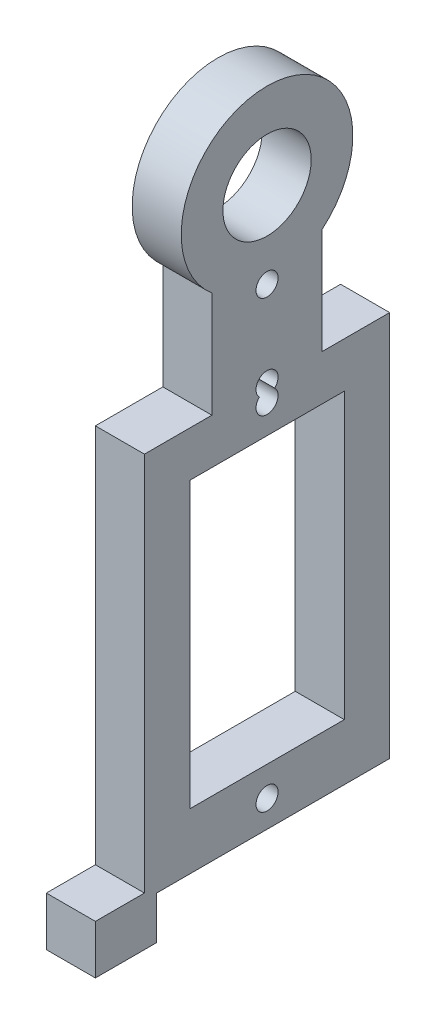
ISO-10303-21;
HEADER;
FILE_DESCRIPTION(('STEP AP214'),'2;1');
FILE_NAME('part.step','',(''),(''),'','','');
FILE_SCHEMA(('AUTOMOTIVE_DESIGN { 1 0 10303 214 1 1 1 1 }'));
ENDSEC;
DATA;
#1=APPLICATION_CONTEXT('core data for automotive mechanical design processes');
#2=APPLICATION_PROTOCOL_DEFINITION('international standard','automotive_design',2000,#1);
#3=PRODUCT_CONTEXT('',#1,'mechanical');
#4=PRODUCT('Part','Part','',(#3));
#5=PRODUCT_RELATED_PRODUCT_CATEGORY('part','',(#4));
#6=PRODUCT_DEFINITION_FORMATION('','',#4);
#7=PRODUCT_DEFINITION_CONTEXT('part definition',#1,'design');
#8=PRODUCT_DEFINITION('design','',#6,#7);
#9=PRODUCT_DEFINITION_SHAPE('','',#8);
#10=(LENGTH_UNIT() NAMED_UNIT(*) SI_UNIT(.MILLI.,.METRE.));
#11=(NAMED_UNIT(*) PLANE_ANGLE_UNIT() SI_UNIT($,.RADIAN.));
#12=(NAMED_UNIT(*) SI_UNIT($,.STERADIAN.) SOLID_ANGLE_UNIT());
#13=UNCERTAINTY_MEASURE_WITH_UNIT(LENGTH_MEASURE(1.E-05),#10,'distance_accuracy_value','');
#14=(GEOMETRIC_REPRESENTATION_CONTEXT(3) GLOBAL_UNCERTAINTY_ASSIGNED_CONTEXT((#13)) GLOBAL_UNIT_ASSIGNED_CONTEXT((#10,
#11,#12)) REPRESENTATION_CONTEXT('',''));
#15=CARTESIAN_POINT('',(0.,0.,0.));
#16=DIRECTION('',(0.,0.,1.));
#17=DIRECTION('',(1.,0.,0.));
#18=AXIS2_PLACEMENT_3D('',#15,#16,#17);
#19=CARTESIAN_POINT('',(5.,-14.,0.));
#20=DIRECTION('',(-1.,0.,0.));
#21=DIRECTION('',(0.,0.,1.));
#22=AXIS2_PLACEMENT_3D('',#19,#20,#21);
#23=CYLINDRICAL_SURFACE('',#22,0.9);
#24=CARTESIAN_POINT('',(4.,-14.,0.));
#25=DIRECTION('',(1.,0.,0.));
#26=DIRECTION('',(0.,0.,-1.));
#27=AXIS2_PLACEMENT_3D('',#24,#25,#26);
#28=CIRCLE('',#27,0.9);
#29=CARTESIAN_POINT('',(4.,-14.65,0.622494979899437));
#30=VERTEX_POINT('',#29);
#31=CARTESIAN_POINT('',(4.,-14.65,-0.622494979899437));
#32=VERTEX_POINT('',#31);
#33=EDGE_CURVE('E179',#30,#32,#28,.F.);
#34=ORIENTED_EDGE('',*,*,#33,.F.);
#35=DIRECTION('',(-1.,0.,0.));
#36=VECTOR('',#35,1.);
#37=CARTESIAN_POINT('',(2.,-14.65,0.622494979899437));
#38=LINE('',#37,#36);
#39=CARTESIAN_POINT('',(0.,-14.65,0.622494979899437));
#40=VERTEX_POINT('',#39);
#41=EDGE_CURVE('E11',#30,#40,#38,.T.);
#42=ORIENTED_EDGE('',*,*,#41,.T.);
#43=CARTESIAN_POINT('',(0.,-14.,0.));
#44=DIRECTION('',(1.,0.,0.));
#45=DIRECTION('',(0.,0.,-1.));
#46=AXIS2_PLACEMENT_3D('',#43,#44,#45);
#47=CIRCLE('',#46,0.9);
#48=CARTESIAN_POINT('',(0.,-14.65,-0.622494979899438));
#49=VERTEX_POINT('',#48);
#50=EDGE_CURVE('E177',#40,#49,#47,.F.);
#51=ORIENTED_EDGE('',*,*,#50,.T.);
#52=DIRECTION('',(-1.,0.,0.));
#53=VECTOR('',#52,1.);
#54=CARTESIAN_POINT('',(2.,-14.65,-0.622494979899437));
#55=LINE('',#54,#53);
#56=EDGE_CURVE('E51',#49,#32,#55,.F.);
#57=ORIENTED_EDGE('',*,*,#56,.T.);
#58=EDGE_LOOP('',(#34,#42,#51,#57));
#59=FACE_BOUND('',#58,.T.);
#60=ADVANCED_FACE('F43',(#59),#23,.F.);
#61=CARTESIAN_POINT('',(4.,0.,0.));
#62=DIRECTION('',(1.,0.,0.));
#63=DIRECTION('',(0.,0.,-1.));
#64=AXIS2_PLACEMENT_3D('',#61,#62,#63);
#65=PLANE('',#64);
#66=CARTESIAN_POINT('',(4.,-43.3,0.));
#67=DIRECTION('',(1.,0.,0.));
#68=DIRECTION('',(0.,0.,-1.));
#69=AXIS2_PLACEMENT_3D('',#66,#67,#68);
#70=CIRCLE('',#69,0.9);
#71=CARTESIAN_POINT('',(4.,-43.3,-0.9));
#72=VERTEX_POINT('',#71);
#73=EDGE_CURVE('E202',#72,#72,#70,.F.);
#74=ORIENTED_EDGE('',*,*,#73,.T.);
#75=EDGE_LOOP('',(#74));
#76=FACE_BOUND('',#75,.T.);
#77=ORIENTED_EDGE('',*,*,#33,.T.);
#78=CARTESIAN_POINT('',(4.,-15.3,0.));
#79=DIRECTION('',(1.,0.,0.));
#80=DIRECTION('',(0.,0.,-1.));
#81=AXIS2_PLACEMENT_3D('',#78,#79,#80);
#82=CIRCLE('',#81,0.9);
#83=EDGE_CURVE('E58',#32,#30,#82,.F.);
#84=ORIENTED_EDGE('',*,*,#83,.T.);
#85=EDGE_LOOP('',(#77,#84));
#86=FACE_BOUND('',#85,.T.);
#87=CARTESIAN_POINT('',(4.,-7.,0.));
#88=DIRECTION('',(1.,0.,0.));
#89=DIRECTION('',(0.,0.,-1.));
#90=AXIS2_PLACEMENT_3D('',#87,#88,#89);
#91=CIRCLE('',#90,0.9);
#92=CARTESIAN_POINT('',(4.,-7.,-0.9));
#93=VERTEX_POINT('',#92);
#94=EDGE_CURVE('E226',#93,#93,#91,.F.);
#95=ORIENTED_EDGE('',*,*,#94,.T.);
#96=EDGE_LOOP('',(#95));
#97=FACE_BOUND('',#96,.T.);
#98=CARTESIAN_POINT('',(4.,0.,0.));
#99=DIRECTION('',(1.,0.,0.));
#100=DIRECTION('',(0.,0.,-1.));
#101=AXIS2_PLACEMENT_3D('',#98,#99,#100);
#102=CIRCLE('',#101,3.6);
#103=CARTESIAN_POINT('',(4.,0.,-3.6));
#104=VERTEX_POINT('',#103);
#105=EDGE_CURVE('E230',#104,#104,#102,.F.);
#106=ORIENTED_EDGE('',*,*,#105,.T.);
#107=EDGE_LOOP('',(#106));
#108=FACE_BOUND('',#107,.T.);
#109=DIRECTION('',(0.,1.,0.));
#110=VECTOR('',#109,1.);
#111=CARTESIAN_POINT('',(4.,-49.,9.));
#112=LINE('',#111,#110);
#113=CARTESIAN_POINT('',(4.,-49.,9.));
#114=VERTEX_POINT('',#113);
#115=CARTESIAN_POINT('',(4.,-45.5,9.));
#116=VERTEX_POINT('',#115);
#117=EDGE_CURVE('E238',#114,#116,#112,.T.);
#118=ORIENTED_EDGE('',*,*,#117,.T.);
#119=DIRECTION('',(0.,0.,-1.));
#120=VECTOR('',#119,1.);
#121=CARTESIAN_POINT('',(4.,-45.5,10.));
#122=LINE('',#121,#120);
#123=CARTESIAN_POINT('',(4.,-45.5,-10.));
#124=VERTEX_POINT('',#123);
#125=EDGE_CURVE('E286',#116,#124,#122,.T.);
#126=ORIENTED_EDGE('',*,*,#125,.T.);
#127=DIRECTION('',(0.,1.,0.));
#128=VECTOR('',#127,1.);
#129=CARTESIAN_POINT('',(4.,-45.5,-10.));
#130=LINE('',#129,#128);
#131=CARTESIAN_POINT('',(4.,-14.,-10.));
#132=VERTEX_POINT('',#131);
#133=EDGE_CURVE('E275',#124,#132,#130,.T.);
#134=ORIENTED_EDGE('',*,*,#133,.T.);
#135=DIRECTION('',(0.,0.,-1.));
#136=VECTOR('',#135,1.);
#137=CARTESIAN_POINT('',(4.,-14.,10.));
#138=LINE('',#137,#136);
#139=CARTESIAN_POINT('',(4.,-14.,-4.5));
#140=VERTEX_POINT('',#139);
#141=EDGE_CURVE('E283',#140,#132,#138,.T.);
#142=ORIENTED_EDGE('',*,*,#141,.F.);
#143=DIRECTION('',(0.,1.,0.));
#144=VECTOR('',#143,1.);
#145=CARTESIAN_POINT('',(4.,-34.,-4.5));
#146=LINE('',#145,#144);
#147=CARTESIAN_POINT('',(4.,-5.3619026473818,-4.5));
#148=VERTEX_POINT('',#147);
#149=EDGE_CURVE('E297',#140,#148,#146,.T.);
#150=ORIENTED_EDGE('',*,*,#149,.T.);
#151=CARTESIAN_POINT('',(4.,0.,0.));
#152=DIRECTION('',(1.,0.,0.));
#153=DIRECTION('',(0.,0.,-1.));
#154=AXIS2_PLACEMENT_3D('',#151,#152,#153);
#155=CIRCLE('',#154,7.);
#156=CARTESIAN_POINT('',(4.,-5.3619026473818,4.5));
#157=VERTEX_POINT('',#156);
#158=EDGE_CURVE('E308',#148,#157,#155,.T.);
#159=ORIENTED_EDGE('',*,*,#158,.T.);
#160=DIRECTION('',(0.,1.,0.));
#161=VECTOR('',#160,1.);
#162=CARTESIAN_POINT('',(4.,-34.,4.5));
#163=LINE('',#162,#161);
#164=CARTESIAN_POINT('',(4.,-14.,4.5));
#165=VERTEX_POINT('',#164);
#166=EDGE_CURVE('E296',#165,#157,#163,.T.);
#167=ORIENTED_EDGE('',*,*,#166,.F.);
#168=CARTESIAN_POINT('',(4.,-14.,10.));
#169=VERTEX_POINT('',#168);
#170=EDGE_CURVE('E284',#169,#165,#138,.T.);
#171=ORIENTED_EDGE('',*,*,#170,.F.);
#172=DIRECTION('',(0.,1.,0.));
#173=VECTOR('',#172,1.);
#174=CARTESIAN_POINT('',(4.,-45.5,10.));
#175=LINE('',#174,#173);
#176=CARTESIAN_POINT('',(4.,-45.,10.));
#177=VERTEX_POINT('',#176);
#178=EDGE_CURVE('E264',#177,#169,#175,.T.);
#179=ORIENTED_EDGE('',*,*,#178,.F.);
#180=DIRECTION('',(0.,0.,-1.));
#181=VECTOR('',#180,1.);
#182=CARTESIAN_POINT('',(4.,-45.,14.));
#183=LINE('',#182,#181);
#184=CARTESIAN_POINT('',(4.,-45.,14.));
#185=VERTEX_POINT('',#184);
#186=EDGE_CURVE('E252',#185,#177,#183,.T.);
#187=ORIENTED_EDGE('',*,*,#186,.F.);
#188=DIRECTION('',(0.,1.,0.));
#189=VECTOR('',#188,1.);
#190=CARTESIAN_POINT('',(4.,-49.,14.));
#191=LINE('',#190,#189);
#192=CARTESIAN_POINT('',(4.,-49.,14.));
#193=VERTEX_POINT('',#192);
#194=EDGE_CURVE('E240',#193,#185,#191,.T.);
#195=ORIENTED_EDGE('',*,*,#194,.F.);
#196=DIRECTION('',(0.,0.,-1.));
#197=VECTOR('',#196,1.);
#198=CARTESIAN_POINT('',(4.,-49.,14.));
#199=LINE('',#198,#197);
#200=EDGE_CURVE('E255',#193,#114,#199,.T.);
#201=ORIENTED_EDGE('',*,*,#200,.T.);
#202=EDGE_LOOP('',(#118,#126,#134,#142,#150,#159,#167,#171,#179,#187,#195,#201));
#203=FACE_BOUND('',#202,.T.);
#204=DIRECTION('',(0.,0.,1.));
#205=VECTOR('',#204,1.);
#206=CARTESIAN_POINT('',(4.,-40.9,0.));
#207=LINE('',#206,#205);
#208=CARTESIAN_POINT('',(4.,-40.9,-6.3));
#209=VERTEX_POINT('',#208);
#210=CARTESIAN_POINT('',(4.,-40.9,6.3));
#211=VERTEX_POINT('',#210);
#212=EDGE_CURVE('E180',#209,#211,#207,.T.);
#213=ORIENTED_EDGE('',*,*,#212,.T.);
#214=DIRECTION('',(0.,1.,0.));
#215=VECTOR('',#214,1.);
#216=CARTESIAN_POINT('',(4.,0.,6.3));
#217=LINE('',#216,#215);
#218=CARTESIAN_POINT('',(4.,-17.7,6.3));
#219=VERTEX_POINT('',#218);
#220=EDGE_CURVE('E221',#211,#219,#217,.T.);
#221=ORIENTED_EDGE('',*,*,#220,.T.);
#222=DIRECTION('',(0.,0.,-1.));
#223=VECTOR('',#222,1.);
#224=CARTESIAN_POINT('',(4.,-17.7,0.));
#225=LINE('',#224,#223);
#226=CARTESIAN_POINT('',(4.,-17.7,-6.3));
#227=VERTEX_POINT('',#226);
#228=EDGE_CURVE('E185',#219,#227,#225,.T.);
#229=ORIENTED_EDGE('',*,*,#228,.T.);
#230=DIRECTION('',(0.,1.,0.));
#231=VECTOR('',#230,1.);
#232=CARTESIAN_POINT('',(4.,0.,-6.3));
#233=LINE('',#232,#231);
#234=EDGE_CURVE('E217',#209,#227,#233,.T.);
#235=ORIENTED_EDGE('',*,*,#234,.F.);
#236=EDGE_LOOP('',(#213,#221,#229,#235));
#237=FACE_BOUND('',#236,.T.);
#238=ADVANCED_FACE('F327',(#76,#86,#97,#108,#203,#237),#65,.T.);
#239=CARTESIAN_POINT('',(0.,0.,0.));
#240=DIRECTION('',(1.,0.,0.));
#241=DIRECTION('',(0.,0.,-1.));
#242=AXIS2_PLACEMENT_3D('',#239,#240,#241);
#243=PLANE('',#242);
#244=CARTESIAN_POINT('',(0.,-15.3,0.));
#245=DIRECTION('',(1.,0.,0.));
#246=DIRECTION('',(0.,0.,-1.));
#247=AXIS2_PLACEMENT_3D('',#244,#245,#246);
#248=CIRCLE('',#247,0.9);
#249=EDGE_CURVE('E167',#49,#40,#248,.F.);
#250=ORIENTED_EDGE('',*,*,#249,.F.);
#251=ORIENTED_EDGE('',*,*,#50,.F.);
#252=EDGE_LOOP('',(#250,#251));
#253=FACE_BOUND('',#252,.T.);
#254=CARTESIAN_POINT('',(0.,-43.3,0.));
#255=DIRECTION('',(1.,0.,0.));
#256=DIRECTION('',(0.,0.,-1.));
#257=AXIS2_PLACEMENT_3D('',#254,#255,#256);
#258=CIRCLE('',#257,0.9);
#259=CARTESIAN_POINT('',(0.,-43.3,-0.9));
#260=VERTEX_POINT('',#259);
#261=EDGE_CURVE('E200',#260,#260,#258,.F.);
#262=ORIENTED_EDGE('',*,*,#261,.F.);
#263=EDGE_LOOP('',(#262));
#264=FACE_BOUND('',#263,.T.);
#265=DIRECTION('',(0.,0.,-1.));
#266=VECTOR('',#265,1.);
#267=CARTESIAN_POINT('',(0.,-45.,14.));
#268=LINE('',#267,#266);
#269=CARTESIAN_POINT('',(0.,-45.,14.));
#270=VERTEX_POINT('',#269);
#271=CARTESIAN_POINT('',(0.,-45.,10.));
#272=VERTEX_POINT('',#271);
#273=EDGE_CURVE('E244',#270,#272,#268,.T.);
#274=ORIENTED_EDGE('',*,*,#273,.T.);
#275=DIRECTION('',(0.,-1.,0.));
#276=VECTOR('',#275,1.);
#277=CARTESIAN_POINT('',(0.,-45.5,10.));
#278=LINE('',#277,#276);
#279=CARTESIAN_POINT('',(0.,-14.,10.));
#280=VERTEX_POINT('',#279);
#281=EDGE_CURVE('E262',#280,#272,#278,.T.);
#282=ORIENTED_EDGE('',*,*,#281,.F.);
#283=DIRECTION('',(0.,0.,-1.));
#284=VECTOR('',#283,1.);
#285=CARTESIAN_POINT('',(0.,-14.,10.));
#286=LINE('',#285,#284);
#287=CARTESIAN_POINT('',(0.,-14.,4.5));
#288=VERTEX_POINT('',#287);
#289=EDGE_CURVE('E280',#280,#288,#286,.T.);
#290=ORIENTED_EDGE('',*,*,#289,.T.);
#291=DIRECTION('',(0.,-1.,0.));
#292=VECTOR('',#291,1.);
#293=CARTESIAN_POINT('',(0.,-34.,4.5));
#294=LINE('',#293,#292);
#295=CARTESIAN_POINT('',(0.,-5.3619026473818,4.5));
#296=VERTEX_POINT('',#295);
#297=EDGE_CURVE('E293',#296,#288,#294,.T.);
#298=ORIENTED_EDGE('',*,*,#297,.F.);
#299=CARTESIAN_POINT('',(0.,0.,0.));
#300=DIRECTION('',(1.,0.,0.));
#301=DIRECTION('',(0.,0.,-1.));
#302=AXIS2_PLACEMENT_3D('',#299,#300,#301);
#303=CIRCLE('',#302,7.);
#304=CARTESIAN_POINT('',(0.,-5.3619026473818,-4.5));
#305=VERTEX_POINT('',#304);
#306=EDGE_CURVE('E307',#305,#296,#303,.T.);
#307=ORIENTED_EDGE('',*,*,#306,.F.);
#308=DIRECTION('',(0.,-1.,0.));
#309=VECTOR('',#308,1.);
#310=CARTESIAN_POINT('',(0.,-34.,-4.5));
#311=LINE('',#310,#309);
#312=CARTESIAN_POINT('',(0.,-14.,-4.5));
#313=VERTEX_POINT('',#312);
#314=EDGE_CURVE('E292',#305,#313,#311,.T.);
#315=ORIENTED_EDGE('',*,*,#314,.T.);
#316=CARTESIAN_POINT('',(0.,-14.,-10.));
#317=VERTEX_POINT('',#316);
#318=EDGE_CURVE('E269',#313,#317,#286,.T.);
#319=ORIENTED_EDGE('',*,*,#318,.T.);
#320=DIRECTION('',(0.,-1.,0.));
#321=VECTOR('',#320,1.);
#322=CARTESIAN_POINT('',(0.,-45.5,-10.));
#323=LINE('',#322,#321);
#324=CARTESIAN_POINT('',(0.,-45.5,-10.));
#325=VERTEX_POINT('',#324);
#326=EDGE_CURVE('E261',#317,#325,#323,.T.);
#327=ORIENTED_EDGE('',*,*,#326,.T.);
#328=DIRECTION('',(0.,0.,-1.));
#329=VECTOR('',#328,1.);
#330=CARTESIAN_POINT('',(0.,-45.5,10.));
#331=LINE('',#330,#329);
#332=CARTESIAN_POINT('',(0.,-45.5,9.));
#333=VERTEX_POINT('',#332);
#334=EDGE_CURVE('E288',#333,#325,#331,.T.);
#335=ORIENTED_EDGE('',*,*,#334,.F.);
#336=DIRECTION('',(0.,-1.,0.));
#337=VECTOR('',#336,1.);
#338=CARTESIAN_POINT('',(0.,-49.,9.));
#339=LINE('',#338,#337);
#340=CARTESIAN_POINT('',(0.,-49.,9.));
#341=VERTEX_POINT('',#340);
#342=EDGE_CURVE('E233',#333,#341,#339,.T.);
#343=ORIENTED_EDGE('',*,*,#342,.T.);
#344=DIRECTION('',(0.,0.,-1.));
#345=VECTOR('',#344,1.);
#346=CARTESIAN_POINT('',(0.,-49.,14.));
#347=LINE('',#346,#345);
#348=CARTESIAN_POINT('',(0.,-49.,14.));
#349=VERTEX_POINT('',#348);
#350=EDGE_CURVE('E258',#349,#341,#347,.T.);
#351=ORIENTED_EDGE('',*,*,#350,.F.);
#352=DIRECTION('',(0.,-1.,0.));
#353=VECTOR('',#352,1.);
#354=CARTESIAN_POINT('',(0.,-49.,14.));
#355=LINE('',#354,#353);
#356=EDGE_CURVE('E234',#270,#349,#355,.T.);
#357=ORIENTED_EDGE('',*,*,#356,.F.);
#358=EDGE_LOOP('',(#274,#282,#290,#298,#307,#315,#319,#327,#335,#343,#351,#357));
#359=FACE_BOUND('',#358,.T.);
#360=CARTESIAN_POINT('',(0.,0.,0.));
#361=DIRECTION('',(1.,0.,0.));
#362=DIRECTION('',(0.,0.,-1.));
#363=AXIS2_PLACEMENT_3D('',#360,#361,#362);
#364=CIRCLE('',#363,3.6);
#365=CARTESIAN_POINT('',(0.,0.,-3.6));
#366=VERTEX_POINT('',#365);
#367=EDGE_CURVE('E229',#366,#366,#364,.F.);
#368=ORIENTED_EDGE('',*,*,#367,.F.);
#369=EDGE_LOOP('',(#368));
#370=FACE_BOUND('',#369,.T.);
#371=CARTESIAN_POINT('',(0.,-7.,0.));
#372=DIRECTION('',(1.,0.,0.));
#373=DIRECTION('',(0.,0.,-1.));
#374=AXIS2_PLACEMENT_3D('',#371,#372,#373);
#375=CIRCLE('',#374,0.9);
#376=CARTESIAN_POINT('',(0.,-7.,-0.9));
#377=VERTEX_POINT('',#376);
#378=EDGE_CURVE('E182',#377,#377,#375,.F.);
#379=ORIENTED_EDGE('',*,*,#378,.F.);
#380=EDGE_LOOP('',(#379));
#381=FACE_BOUND('',#380,.T.);
#382=DIRECTION('',(0.,1.,0.));
#383=VECTOR('',#382,1.);
#384=CARTESIAN_POINT('',(0.,0.,6.3));
#385=LINE('',#384,#383);
#386=CARTESIAN_POINT('',(0.,-40.9,6.3));
#387=VERTEX_POINT('',#386);
#388=CARTESIAN_POINT('',(0.,-17.7,6.3));
#389=VERTEX_POINT('',#388);
#390=EDGE_CURVE('E172',#387,#389,#385,.T.);
#391=ORIENTED_EDGE('',*,*,#390,.F.);
#392=DIRECTION('',(0.,0.,1.));
#393=VECTOR('',#392,1.);
#394=CARTESIAN_POINT('',(0.,-40.9,0.));
#395=LINE('',#394,#393);
#396=CARTESIAN_POINT('',(0.,-40.9,-6.3));
#397=VERTEX_POINT('',#396);
#398=EDGE_CURVE('E197',#397,#387,#395,.T.);
#399=ORIENTED_EDGE('',*,*,#398,.F.);
#400=DIRECTION('',(0.,1.,0.));
#401=VECTOR('',#400,1.);
#402=CARTESIAN_POINT('',(0.,0.,-6.3));
#403=LINE('',#402,#401);
#404=CARTESIAN_POINT('',(0.,-17.7,-6.3));
#405=VERTEX_POINT('',#404);
#406=EDGE_CURVE('E190',#397,#405,#403,.T.);
#407=ORIENTED_EDGE('',*,*,#406,.T.);
#408=DIRECTION('',(0.,0.,-1.));
#409=VECTOR('',#408,1.);
#410=CARTESIAN_POINT('',(0.,-17.7,0.));
#411=LINE('',#410,#409);
#412=EDGE_CURVE('E193',#389,#405,#411,.T.);
#413=ORIENTED_EDGE('',*,*,#412,.F.);
#414=EDGE_LOOP('',(#391,#399,#407,#413));
#415=FACE_BOUND('',#414,.T.);
#416=ADVANCED_FACE('F175',(#253,#264,#359,#370,#381,#415),#243,.F.);
#417=CARTESIAN_POINT('',(0.,0.,10.));
#418=DIRECTION('',(0.,0.,-1.));
#419=DIRECTION('',(-1.,0.,0.));
#420=AXIS2_PLACEMENT_3D('',#417,#418,#419);
#421=PLANE('',#420);
#422=DIRECTION('',(-1.,0.,0.));
#423=VECTOR('',#422,1.);
#424=CARTESIAN_POINT('',(0.,-45.,10.));
#425=LINE('',#424,#423);
#426=EDGE_CURVE('E316',#177,#272,#425,.T.);
#427=ORIENTED_EDGE('',*,*,#426,.F.);
#428=ORIENTED_EDGE('',*,*,#178,.T.);
#429=DIRECTION('',(-1.,0.,0.));
#430=VECTOR('',#429,1.);
#431=CARTESIAN_POINT('',(0.,-14.,10.));
#432=LINE('',#431,#430);
#433=EDGE_CURVE('E267',#169,#280,#432,.T.);
#434=ORIENTED_EDGE('',*,*,#433,.T.);
#435=ORIENTED_EDGE('',*,*,#281,.T.);
#436=EDGE_LOOP('',(#427,#428,#434,#435));
#437=FACE_BOUND('',#436,.T.);
#438=ADVANCED_FACE('F326',(#437),#421,.F.);
#439=CARTESIAN_POINT('',(0.,0.,4.5));
#440=DIRECTION('',(0.,0.,-1.));
#441=DIRECTION('',(-1.,0.,0.));
#442=AXIS2_PLACEMENT_3D('',#439,#440,#441);
#443=PLANE('',#442);
#444=DIRECTION('',(-1.,0.,0.));
#445=VECTOR('',#444,1.);
#446=CARTESIAN_POINT('',(0.,-14.,4.5));
#447=LINE('',#446,#445);
#448=EDGE_CURVE('E290',#165,#288,#447,.T.);
#449=ORIENTED_EDGE('',*,*,#448,.F.);
#450=ORIENTED_EDGE('',*,*,#166,.T.);
#451=DIRECTION('',(-1.,0.,0.));
#452=VECTOR('',#451,1.);
#453=CARTESIAN_POINT('',(4.,-5.3619026473818,4.5));
#454=LINE('',#453,#452);
#455=EDGE_CURVE('E305',#157,#296,#454,.T.);
#456=ORIENTED_EDGE('',*,*,#455,.T.);
#457=ORIENTED_EDGE('',*,*,#297,.T.);
#458=EDGE_LOOP('',(#449,#450,#456,#457));
#459=FACE_BOUND('',#458,.T.);
#460=ADVANCED_FACE('F385',(#459),#443,.F.);
#461=CARTESIAN_POINT('',(0.,0.,-4.5));
#462=DIRECTION('',(0.,0.,-1.));
#463=DIRECTION('',(-1.,0.,0.));
#464=AXIS2_PLACEMENT_3D('',#461,#462,#463);
#465=PLANE('',#464);
#466=ORIENTED_EDGE('',*,*,#149,.F.);
#467=DIRECTION('',(-1.,0.,0.));
#468=VECTOR('',#467,1.);
#469=CARTESIAN_POINT('',(0.,-14.,-4.5));
#470=LINE('',#469,#468);
#471=EDGE_CURVE('E311',#140,#313,#470,.T.);
#472=ORIENTED_EDGE('',*,*,#471,.T.);
#473=ORIENTED_EDGE('',*,*,#314,.F.);
#474=DIRECTION('',(-1.,0.,0.));
#475=VECTOR('',#474,1.);
#476=CARTESIAN_POINT('',(4.,-5.3619026473818,-4.5));
#477=LINE('',#476,#475);
#478=EDGE_CURVE('E299',#148,#305,#477,.T.);
#479=ORIENTED_EDGE('',*,*,#478,.F.);
#480=EDGE_LOOP('',(#466,#472,#473,#479));
#481=FACE_BOUND('',#480,.T.);
#482=ADVANCED_FACE('F401',(#481),#465,.T.);
#483=CARTESIAN_POINT('',(4.,0.,0.));
#484=DIRECTION('',(-1.,0.,0.));
#485=DIRECTION('',(0.,0.,1.));
#486=AXIS2_PLACEMENT_3D('',#483,#484,#485);
#487=CYLINDRICAL_SURFACE('',#486,7.);
#488=ORIENTED_EDGE('',*,*,#455,.F.);
#489=ORIENTED_EDGE('',*,*,#158,.F.);
#490=ORIENTED_EDGE('',*,*,#478,.T.);
#491=ORIENTED_EDGE('',*,*,#306,.T.);
#492=EDGE_LOOP('',(#488,#489,#490,#491));
#493=FACE_BOUND('',#492,.T.);
#494=ADVANCED_FACE('F45',(#493),#487,.T.);
#495=CARTESIAN_POINT('',(0.,-14.,10.));
#496=DIRECTION('',(0.,-1.,0.));
#497=DIRECTION('',(0.,0.,-1.));
#498=AXIS2_PLACEMENT_3D('',#495,#496,#497);
#499=PLANE('',#498);
#500=ORIENTED_EDGE('',*,*,#170,.T.);
#501=ORIENTED_EDGE('',*,*,#448,.T.);
#502=ORIENTED_EDGE('',*,*,#289,.F.);
#503=ORIENTED_EDGE('',*,*,#433,.F.);
#504=EDGE_LOOP('',(#500,#501,#502,#503));
#505=FACE_BOUND('',#504,.T.);
#506=ADVANCED_FACE('F395',(#505),#499,.F.);
#507=CARTESIAN_POINT('',(0.,-45.5,10.));
#508=DIRECTION('',(0.,1.,0.));
#509=DIRECTION('',(0.,0.,1.));
#510=AXIS2_PLACEMENT_3D('',#507,#508,#509);
#511=PLANE('',#510);
#512=ORIENTED_EDGE('',*,*,#125,.F.);
#513=DIRECTION('',(-1.,0.,0.));
#514=VECTOR('',#513,1.);
#515=CARTESIAN_POINT('',(0.,-45.5,9.));
#516=LINE('',#515,#514);
#517=EDGE_CURVE('E194',#116,#333,#516,.T.);
#518=ORIENTED_EDGE('',*,*,#517,.T.);
#519=ORIENTED_EDGE('',*,*,#334,.T.);
#520=DIRECTION('',(1.,0.,0.));
#521=VECTOR('',#520,1.);
#522=CARTESIAN_POINT('',(0.,-45.5,-10.));
#523=LINE('',#522,#521);
#524=EDGE_CURVE('E272',#325,#124,#523,.T.);
#525=ORIENTED_EDGE('',*,*,#524,.T.);
#526=EDGE_LOOP('',(#512,#518,#519,#525));
#527=FACE_BOUND('',#526,.T.);
#528=ADVANCED_FACE('F393',(#527),#511,.F.);
#529=ORIENTED_EDGE('',*,*,#471,.F.);
#530=ORIENTED_EDGE('',*,*,#141,.T.);
#531=DIRECTION('',(-1.,0.,0.));
#532=VECTOR('',#531,1.);
#533=CARTESIAN_POINT('',(0.,-14.,-10.));
#534=LINE('',#533,#532);
#535=EDGE_CURVE('E265',#132,#317,#534,.T.);
#536=ORIENTED_EDGE('',*,*,#535,.T.);
#537=ORIENTED_EDGE('',*,*,#318,.F.);
#538=EDGE_LOOP('',(#529,#530,#536,#537));
#539=FACE_BOUND('',#538,.T.);
#540=ADVANCED_FACE('F389',(#539),#499,.F.);
#541=CARTESIAN_POINT('',(0.,0.,-10.));
#542=DIRECTION('',(0.,0.,-1.));
#543=DIRECTION('',(-1.,0.,0.));
#544=AXIS2_PLACEMENT_3D('',#541,#542,#543);
#545=PLANE('',#544);
#546=ORIENTED_EDGE('',*,*,#326,.F.);
#547=ORIENTED_EDGE('',*,*,#535,.F.);
#548=ORIENTED_EDGE('',*,*,#133,.F.);
#549=ORIENTED_EDGE('',*,*,#524,.F.);
#550=EDGE_LOOP('',(#546,#547,#548,#549));
#551=FACE_BOUND('',#550,.T.);
#552=ADVANCED_FACE('F375',(#551),#545,.T.);
#553=CARTESIAN_POINT('',(0.,0.,9.));
#554=DIRECTION('',(0.,0.,-1.));
#555=DIRECTION('',(-1.,0.,0.));
#556=AXIS2_PLACEMENT_3D('',#553,#554,#555);
#557=PLANE('',#556);
#558=ORIENTED_EDGE('',*,*,#517,.F.);
#559=ORIENTED_EDGE('',*,*,#117,.F.);
#560=DIRECTION('',(1.,0.,0.));
#561=VECTOR('',#560,1.);
#562=CARTESIAN_POINT('',(0.,-49.,9.));
#563=LINE('',#562,#561);
#564=EDGE_CURVE('E246',#341,#114,#563,.T.);
#565=ORIENTED_EDGE('',*,*,#564,.F.);
#566=ORIENTED_EDGE('',*,*,#342,.F.);
#567=EDGE_LOOP('',(#558,#559,#565,#566));
#568=FACE_BOUND('',#567,.T.);
#569=ADVANCED_FACE('F371',(#568),#557,.T.);
#570=CARTESIAN_POINT('',(0.,-45.,14.));
#571=DIRECTION('',(0.,-1.,0.));
#572=DIRECTION('',(0.,0.,-1.));
#573=AXIS2_PLACEMENT_3D('',#570,#571,#572);
#574=PLANE('',#573);
#575=ORIENTED_EDGE('',*,*,#186,.T.);
#576=ORIENTED_EDGE('',*,*,#426,.T.);
#577=ORIENTED_EDGE('',*,*,#273,.F.);
#578=DIRECTION('',(-1.,0.,0.));
#579=VECTOR('',#578,1.);
#580=CARTESIAN_POINT('',(0.,-45.,14.));
#581=LINE('',#580,#579);
#582=EDGE_CURVE('E242',#185,#270,#581,.T.);
#583=ORIENTED_EDGE('',*,*,#582,.F.);
#584=EDGE_LOOP('',(#575,#576,#577,#583));
#585=FACE_BOUND('',#584,.T.);
#586=ADVANCED_FACE('F374',(#585),#574,.F.);
#587=CARTESIAN_POINT('',(0.,-49.,14.));
#588=DIRECTION('',(0.,1.,0.));
#589=DIRECTION('',(0.,0.,1.));
#590=AXIS2_PLACEMENT_3D('',#587,#588,#589);
#591=PLANE('',#590);
#592=ORIENTED_EDGE('',*,*,#564,.T.);
#593=ORIENTED_EDGE('',*,*,#200,.F.);
#594=DIRECTION('',(1.,0.,0.));
#595=VECTOR('',#594,1.);
#596=CARTESIAN_POINT('',(0.,-49.,14.));
#597=LINE('',#596,#595);
#598=EDGE_CURVE('E237',#349,#193,#597,.T.);
#599=ORIENTED_EDGE('',*,*,#598,.F.);
#600=ORIENTED_EDGE('',*,*,#350,.T.);
#601=EDGE_LOOP('',(#592,#593,#599,#600));
#602=FACE_BOUND('',#601,.T.);
#603=ADVANCED_FACE('F369',(#602),#591,.F.);
#604=CARTESIAN_POINT('',(0.,0.,14.));
#605=DIRECTION('',(0.,0.,-1.));
#606=DIRECTION('',(-1.,0.,0.));
#607=AXIS2_PLACEMENT_3D('',#604,#605,#606);
#608=PLANE('',#607);
#609=ORIENTED_EDGE('',*,*,#356,.T.);
#610=ORIENTED_EDGE('',*,*,#598,.T.);
#611=ORIENTED_EDGE('',*,*,#194,.T.);
#612=ORIENTED_EDGE('',*,*,#582,.T.);
#613=EDGE_LOOP('',(#609,#610,#611,#612));
#614=FACE_BOUND('',#613,.T.);
#615=ADVANCED_FACE('F365',(#614),#608,.F.);
#616=CARTESIAN_POINT('',(5.,0.,0.));
#617=DIRECTION('',(-1.,0.,0.));
#618=DIRECTION('',(0.,0.,1.));
#619=AXIS2_PLACEMENT_3D('',#616,#617,#618);
#620=CYLINDRICAL_SURFACE('',#619,3.6);
#621=ORIENTED_EDGE('',*,*,#105,.F.);
#622=EDGE_LOOP('',(#621));
#623=FACE_BOUND('',#622,.T.);
#624=ORIENTED_EDGE('',*,*,#367,.T.);
#625=EDGE_LOOP('',(#624));
#626=FACE_BOUND('',#625,.T.);
#627=ADVANCED_FACE('F322',(#623,#626),#620,.F.);
#628=CARTESIAN_POINT('',(5.,-7.,0.));
#629=DIRECTION('',(-1.,0.,0.));
#630=DIRECTION('',(0.,0.,1.));
#631=AXIS2_PLACEMENT_3D('',#628,#629,#630);
#632=CYLINDRICAL_SURFACE('',#631,0.9);
#633=ORIENTED_EDGE('',*,*,#94,.F.);
#634=EDGE_LOOP('',(#633));
#635=FACE_BOUND('',#634,.T.);
#636=ORIENTED_EDGE('',*,*,#378,.T.);
#637=EDGE_LOOP('',(#636));
#638=FACE_BOUND('',#637,.T.);
#639=ADVANCED_FACE('F346',(#635,#638),#632,.F.);
#640=CARTESIAN_POINT('',(-1.,-40.9,6.3));
#641=DIRECTION('',(0.,1.,0.));
#642=DIRECTION('',(0.,0.,1.));
#643=AXIS2_PLACEMENT_3D('',#640,#641,#642);
#644=PLANE('',#643);
#645=DIRECTION('',(1.,0.,0.));
#646=VECTOR('',#645,1.);
#647=CARTESIAN_POINT('',(-1.,-40.9,-6.3));
#648=LINE('',#647,#646);
#649=EDGE_CURVE('E66',#397,#209,#648,.T.);
#650=ORIENTED_EDGE('',*,*,#649,.F.);
#651=ORIENTED_EDGE('',*,*,#398,.T.);
#652=DIRECTION('',(1.,0.,0.));
#653=VECTOR('',#652,1.);
#654=CARTESIAN_POINT('',(-1.,-40.9,6.3));
#655=LINE('',#654,#653);
#656=EDGE_CURVE('E210',#387,#211,#655,.T.);
#657=ORIENTED_EDGE('',*,*,#656,.T.);
#658=ORIENTED_EDGE('',*,*,#212,.F.);
#659=EDGE_LOOP('',(#650,#651,#657,#658));
#660=FACE_BOUND('',#659,.T.);
#661=ADVANCED_FACE('F344',(#660),#644,.T.);
#662=CARTESIAN_POINT('',(-1.,-17.7,6.3));
#663=DIRECTION('',(0.,-1.,0.));
#664=DIRECTION('',(0.,0.,-1.));
#665=AXIS2_PLACEMENT_3D('',#662,#663,#664);
#666=PLANE('',#665);
#667=DIRECTION('',(-1.,0.,0.));
#668=VECTOR('',#667,1.);
#669=CARTESIAN_POINT('',(-1.,-17.7,6.3));
#670=LINE('',#669,#668);
#671=EDGE_CURVE('E213',#219,#389,#670,.T.);
#672=ORIENTED_EDGE('',*,*,#671,.T.);
#673=ORIENTED_EDGE('',*,*,#412,.T.);
#674=DIRECTION('',(-1.,0.,0.));
#675=VECTOR('',#674,1.);
#676=CARTESIAN_POINT('',(-1.,-17.7,-6.3));
#677=LINE('',#676,#675);
#678=EDGE_CURVE('E214',#227,#405,#677,.T.);
#679=ORIENTED_EDGE('',*,*,#678,.F.);
#680=ORIENTED_EDGE('',*,*,#228,.F.);
#681=EDGE_LOOP('',(#672,#673,#679,#680));
#682=FACE_BOUND('',#681,.T.);
#683=ADVANCED_FACE('F339',(#682),#666,.T.);
#684=CARTESIAN_POINT('',(0.,0.,6.3));
#685=DIRECTION('',(0.,0.,-1.));
#686=DIRECTION('',(-1.,0.,0.));
#687=AXIS2_PLACEMENT_3D('',#684,#685,#686);
#688=PLANE('',#687);
#689=ORIENTED_EDGE('',*,*,#656,.F.);
#690=ORIENTED_EDGE('',*,*,#390,.T.);
#691=ORIENTED_EDGE('',*,*,#671,.F.);
#692=ORIENTED_EDGE('',*,*,#220,.F.);
#693=EDGE_LOOP('',(#689,#690,#691,#692));
#694=FACE_BOUND('',#693,.T.);
#695=ADVANCED_FACE('F337',(#694),#688,.T.);
#696=CARTESIAN_POINT('',(0.,0.,-6.3));
#697=DIRECTION('',(0.,0.,-1.));
#698=DIRECTION('',(-1.,0.,0.));
#699=AXIS2_PLACEMENT_3D('',#696,#697,#698);
#700=PLANE('',#699);
#701=ORIENTED_EDGE('',*,*,#234,.T.);
#702=ORIENTED_EDGE('',*,*,#678,.T.);
#703=ORIENTED_EDGE('',*,*,#406,.F.);
#704=ORIENTED_EDGE('',*,*,#649,.T.);
#705=EDGE_LOOP('',(#701,#702,#703,#704));
#706=FACE_BOUND('',#705,.T.);
#707=ADVANCED_FACE('F487',(#706),#700,.F.);
#708=CARTESIAN_POINT('',(5.,-43.3,0.));
#709=DIRECTION('',(-1.,0.,0.));
#710=DIRECTION('',(0.,0.,1.));
#711=AXIS2_PLACEMENT_3D('',#708,#709,#710);
#712=CYLINDRICAL_SURFACE('',#711,0.9);
#713=ORIENTED_EDGE('',*,*,#73,.F.);
#714=EDGE_LOOP('',(#713));
#715=FACE_BOUND('',#714,.T.);
#716=ORIENTED_EDGE('',*,*,#261,.T.);
#717=EDGE_LOOP('',(#716));
#718=FACE_BOUND('',#717,.T.);
#719=ADVANCED_FACE('F451',(#715,#718),#712,.F.);
#720=CARTESIAN_POINT('',(5.,-15.3,0.));
#721=DIRECTION('',(-1.,0.,0.));
#722=DIRECTION('',(0.,0.,1.));
#723=AXIS2_PLACEMENT_3D('',#720,#721,#722);
#724=CYLINDRICAL_SURFACE('',#723,0.9);
#725=ORIENTED_EDGE('',*,*,#83,.F.);
#726=ORIENTED_EDGE('',*,*,#56,.F.);
#727=ORIENTED_EDGE('',*,*,#249,.T.);
#728=ORIENTED_EDGE('',*,*,#41,.F.);
#729=EDGE_LOOP('',(#725,#726,#727,#728));
#730=FACE_BOUND('',#729,.T.);
#731=ADVANCED_FACE('F166',(#730),#724,.F.);
#732=CLOSED_SHELL('',(#60,#238,#416,#438,#460,#482,#494,#506,#528,#540,#552,#569,#586,#603,#615,
#627,#639,#661,#683,#695,#707,#719,#731));
#733=MANIFOLD_SOLID_BREP('B2',#732);
#734=ADVANCED_BREP_SHAPE_REPRESENTATION('',(#18,#733),#14);
#735=SHAPE_DEFINITION_REPRESENTATION(#9,#734);
ENDSEC;
END-ISO-10303-21;
